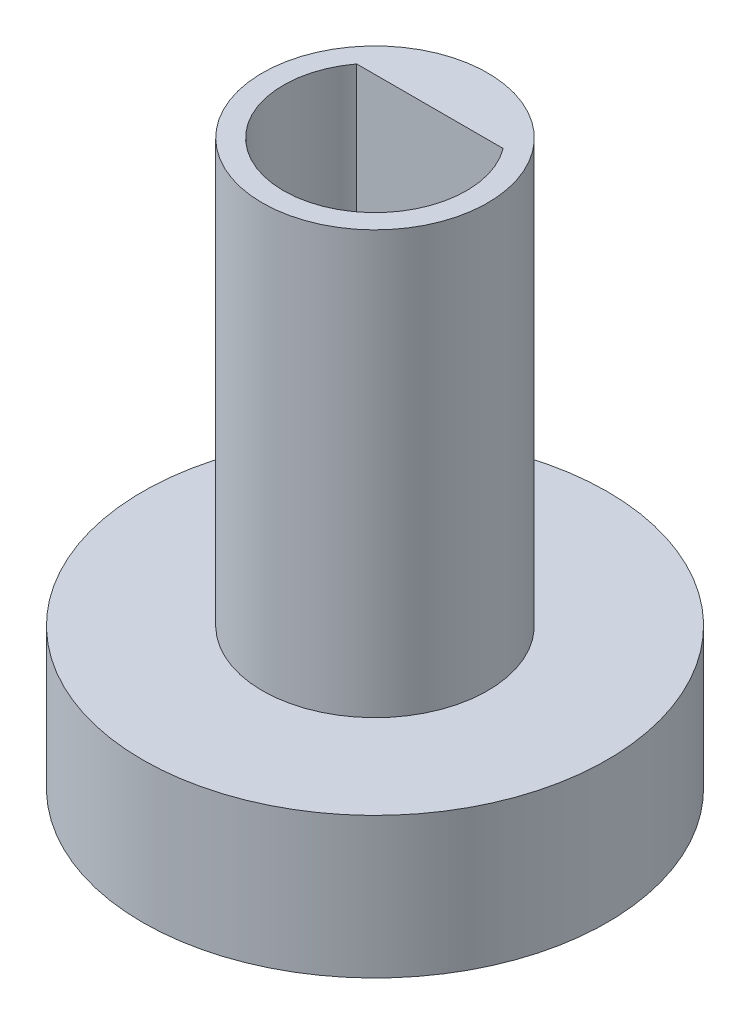
ISO-10303-21;
HEADER;
FILE_DESCRIPTION(('STEP AP214'),'2;1');
FILE_NAME('part.step','',(''),(''),'','','');
FILE_SCHEMA(('AUTOMOTIVE_DESIGN { 1 0 10303 214 1 1 1 1 }'));
ENDSEC;
DATA;
#1=APPLICATION_CONTEXT('core data for automotive mechanical design processes');
#2=APPLICATION_PROTOCOL_DEFINITION('international standard','automotive_design',2000,#1);
#3=PRODUCT_CONTEXT('',#1,'mechanical');
#4=PRODUCT('Part','Part','',(#3));
#5=PRODUCT_RELATED_PRODUCT_CATEGORY('part','',(#4));
#6=PRODUCT_DEFINITION_FORMATION('','',#4);
#7=PRODUCT_DEFINITION_CONTEXT('part definition',#1,'design');
#8=PRODUCT_DEFINITION('design','',#6,#7);
#9=PRODUCT_DEFINITION_SHAPE('','',#8);
#10=(LENGTH_UNIT() NAMED_UNIT(*) SI_UNIT(.MILLI.,.METRE.));
#11=(NAMED_UNIT(*) PLANE_ANGLE_UNIT() SI_UNIT($,.RADIAN.));
#12=(NAMED_UNIT(*) SI_UNIT($,.STERADIAN.) SOLID_ANGLE_UNIT());
#13=UNCERTAINTY_MEASURE_WITH_UNIT(LENGTH_MEASURE(1.E-05),#10,'distance_accuracy_value','');
#14=(GEOMETRIC_REPRESENTATION_CONTEXT(3) GLOBAL_UNCERTAINTY_ASSIGNED_CONTEXT((#13)) GLOBAL_UNIT_ASSIGNED_CONTEXT((#10,
#11,#12)) REPRESENTATION_CONTEXT('',''));
#15=CARTESIAN_POINT('',(0.,0.,0.));
#16=DIRECTION('',(0.,0.,1.));
#17=DIRECTION('',(1.,0.,0.));
#18=AXIS2_PLACEMENT_3D('',#15,#16,#17);
#19=CARTESIAN_POINT('',(0.,5.,0.));
#20=DIRECTION('',(0.,1.,0.));
#21=DIRECTION('',(0.,0.,1.));
#22=AXIS2_PLACEMENT_3D('',#19,#20,#21);
#23=PLANE('',#22);
#24=CARTESIAN_POINT('',(0.,5.,0.));
#25=DIRECTION('',(0.,1.,0.));
#26=DIRECTION('',(0.,0.,1.));
#27=AXIS2_PLACEMENT_3D('',#24,#25,#26);
#28=CIRCLE('',#27,8.25);
#29=CARTESIAN_POINT('',(0.,5.,8.25));
#30=VERTEX_POINT('',#29);
#31=EDGE_CURVE('E11',#30,#30,#28,.T.);
#32=ORIENTED_EDGE('',*,*,#31,.T.);
#33=EDGE_LOOP('',(#32));
#34=FACE_BOUND('',#33,.T.);
#35=CARTESIAN_POINT('',(0.,5.,0.));
#36=DIRECTION('',(0.,1.,0.));
#37=DIRECTION('',(0.,0.,1.));
#38=AXIS2_PLACEMENT_3D('',#35,#36,#37);
#39=CIRCLE('',#38,4.);
#40=CARTESIAN_POINT('',(0.,5.,4.));
#41=VERTEX_POINT('',#40);
#42=EDGE_CURVE('E71',#41,#41,#39,.T.);
#43=ORIENTED_EDGE('',*,*,#42,.F.);
#44=EDGE_LOOP('',(#43));
#45=FACE_BOUND('',#44,.T.);
#46=ADVANCED_FACE('F33',(#34,#45),#23,.T.);
#47=CARTESIAN_POINT('',(0.,0.,0.));
#48=DIRECTION('',(0.,1.,0.));
#49=DIRECTION('',(0.,0.,1.));
#50=AXIS2_PLACEMENT_3D('',#47,#48,#49);
#51=PLANE('',#50);
#52=CARTESIAN_POINT('',(0.,0.,0.));
#53=DIRECTION('',(0.,1.,0.));
#54=DIRECTION('',(0.,0.,1.));
#55=AXIS2_PLACEMENT_3D('',#52,#53,#54);
#56=CIRCLE('',#55,8.25);
#57=CARTESIAN_POINT('',(0.,0.,8.25));
#58=VERTEX_POINT('',#57);
#59=EDGE_CURVE('E37',#58,#58,#56,.T.);
#60=ORIENTED_EDGE('',*,*,#59,.F.);
#61=EDGE_LOOP('',(#60));
#62=FACE_BOUND('',#61,.T.);
#63=CARTESIAN_POINT('',(0.,0.,0.));
#64=DIRECTION('',(0.,1.,0.));
#65=DIRECTION('',(0.,0.,1.));
#66=AXIS2_PLACEMENT_3D('',#63,#64,#65);
#67=CIRCLE('',#66,3.25000000000001);
#68=CARTESIAN_POINT('',(-2.60000000000001,0.,-1.95));
#69=VERTEX_POINT('',#68);
#70=CARTESIAN_POINT('',(2.60000000000001,0.,-1.95));
#71=VERTEX_POINT('',#70);
#72=EDGE_CURVE('E48',#69,#71,#67,.T.);
#73=ORIENTED_EDGE('',*,*,#72,.T.);
#74=DIRECTION('',(-1.,0.,0.));
#75=VECTOR('',#74,1.);
#76=CARTESIAN_POINT('',(-2.60000000000001,0.,-1.95));
#77=LINE('',#76,#75);
#78=EDGE_CURVE('E55',#71,#69,#77,.T.);
#79=ORIENTED_EDGE('',*,*,#78,.T.);
#80=EDGE_LOOP('',(#73,#79));
#81=FACE_BOUND('',#80,.T.);
#82=ADVANCED_FACE('F87',(#62,#81),#51,.F.);
#83=CARTESIAN_POINT('',(0.,5.,0.));
#84=DIRECTION('',(0.,-1.,0.));
#85=DIRECTION('',(0.,0.,-1.));
#86=AXIS2_PLACEMENT_3D('',#83,#84,#85);
#87=CYLINDRICAL_SURFACE('',#86,8.25);
#88=ORIENTED_EDGE('',*,*,#31,.F.);
#89=EDGE_LOOP('',(#88));
#90=FACE_BOUND('',#89,.T.);
#91=ORIENTED_EDGE('',*,*,#59,.T.);
#92=EDGE_LOOP('',(#91));
#93=FACE_BOUND('',#92,.T.);
#94=ADVANCED_FACE('F35',(#90,#93),#87,.T.);
#95=CARTESIAN_POINT('',(0.,5.,0.));
#96=DIRECTION('',(0.,-1.,0.));
#97=DIRECTION('',(0.,0.,-1.));
#98=AXIS2_PLACEMENT_3D('',#95,#96,#97);
#99=CYLINDRICAL_SURFACE('',#98,3.25000000000001);
#100=ORIENTED_EDGE('',*,*,#72,.F.);
#101=DIRECTION('',(0.,-1.,0.));
#102=VECTOR('',#101,1.);
#103=CARTESIAN_POINT('',(-2.60000000000001,5.,-1.95));
#104=LINE('',#103,#102);
#105=CARTESIAN_POINT('',(-2.60000000000001,20.,-1.95));
#106=VERTEX_POINT('',#105);
#107=EDGE_CURVE('E60',#106,#69,#104,.T.);
#108=ORIENTED_EDGE('',*,*,#107,.F.);
#109=CARTESIAN_POINT('',(0.,20.,0.));
#110=DIRECTION('',(0.,1.,0.));
#111=DIRECTION('',(0.,0.,1.));
#112=AXIS2_PLACEMENT_3D('',#109,#110,#111);
#113=CIRCLE('',#112,3.25000000000001);
#114=CARTESIAN_POINT('',(2.60000000000001,20.,-1.95));
#115=VERTEX_POINT('',#114);
#116=EDGE_CURVE('E64',#106,#115,#113,.T.);
#117=ORIENTED_EDGE('',*,*,#116,.T.);
#118=DIRECTION('',(0.,-1.,0.));
#119=VECTOR('',#118,1.);
#120=CARTESIAN_POINT('',(2.60000000000001,5.,-1.95));
#121=LINE('',#120,#119);
#122=EDGE_CURVE('E66',#115,#71,#121,.T.);
#123=ORIENTED_EDGE('',*,*,#122,.T.);
#124=EDGE_LOOP('',(#100,#108,#117,#123));
#125=FACE_BOUND('',#124,.T.);
#126=ADVANCED_FACE('F62',(#125),#99,.F.);
#127=CARTESIAN_POINT('',(-2.60000000000001,5.,-1.95));
#128=DIRECTION('',(0.,0.,1.));
#129=DIRECTION('',(1.,0.,0.));
#130=AXIS2_PLACEMENT_3D('',#127,#128,#129);
#131=PLANE('',#130);
#132=ORIENTED_EDGE('',*,*,#78,.F.);
#133=ORIENTED_EDGE('',*,*,#122,.F.);
#134=DIRECTION('',(-1.,0.,0.));
#135=VECTOR('',#134,1.);
#136=CARTESIAN_POINT('',(2.60000000000001,20.,-1.95));
#137=LINE('',#136,#135);
#138=EDGE_CURVE('E68',#115,#106,#137,.T.);
#139=ORIENTED_EDGE('',*,*,#138,.T.);
#140=ORIENTED_EDGE('',*,*,#107,.T.);
#141=EDGE_LOOP('',(#132,#133,#139,#140));
#142=FACE_BOUND('',#141,.T.);
#143=ADVANCED_FACE('F69',(#142),#131,.T.);
#144=CARTESIAN_POINT('',(0.,20.,0.));
#145=DIRECTION('',(0.,1.,0.));
#146=DIRECTION('',(0.,0.,1.));
#147=AXIS2_PLACEMENT_3D('',#144,#145,#146);
#148=PLANE('',#147);
#149=CARTESIAN_POINT('',(0.,20.,0.));
#150=DIRECTION('',(0.,1.,0.));
#151=DIRECTION('',(0.,0.,1.));
#152=AXIS2_PLACEMENT_3D('',#149,#150,#151);
#153=CIRCLE('',#152,4.);
#154=CARTESIAN_POINT('',(0.,20.,4.));
#155=VERTEX_POINT('',#154);
#156=EDGE_CURVE('E76',#155,#155,#153,.T.);
#157=ORIENTED_EDGE('',*,*,#156,.T.);
#158=EDGE_LOOP('',(#157));
#159=FACE_BOUND('',#158,.T.);
#160=ORIENTED_EDGE('',*,*,#138,.F.);
#161=ORIENTED_EDGE('',*,*,#116,.F.);
#162=EDGE_LOOP('',(#160,#161));
#163=FACE_BOUND('',#162,.T.);
#164=ADVANCED_FACE('F73',(#159,#163),#148,.T.);
#165=CARTESIAN_POINT('',(0.,20.,0.));
#166=DIRECTION('',(0.,-1.,0.));
#167=DIRECTION('',(0.,0.,-1.));
#168=AXIS2_PLACEMENT_3D('',#165,#166,#167);
#169=CYLINDRICAL_SURFACE('',#168,4.);
#170=ORIENTED_EDGE('',*,*,#156,.F.);
#171=EDGE_LOOP('',(#170));
#172=FACE_BOUND('',#171,.T.);
#173=ORIENTED_EDGE('',*,*,#42,.T.);
#174=EDGE_LOOP('',(#173));
#175=FACE_BOUND('',#174,.T.);
#176=ADVANCED_FACE('F102',(#172,#175),#169,.T.);
#177=CLOSED_SHELL('',(#46,#82,#94,#126,#143,#164,#176));
#178=MANIFOLD_SOLID_BREP('B2',#177);
#179=ADVANCED_BREP_SHAPE_REPRESENTATION('',(#18,#178),#14);
#180=SHAPE_DEFINITION_REPRESENTATION(#9,#179);
ENDSEC;
END-ISO-10303-21;
